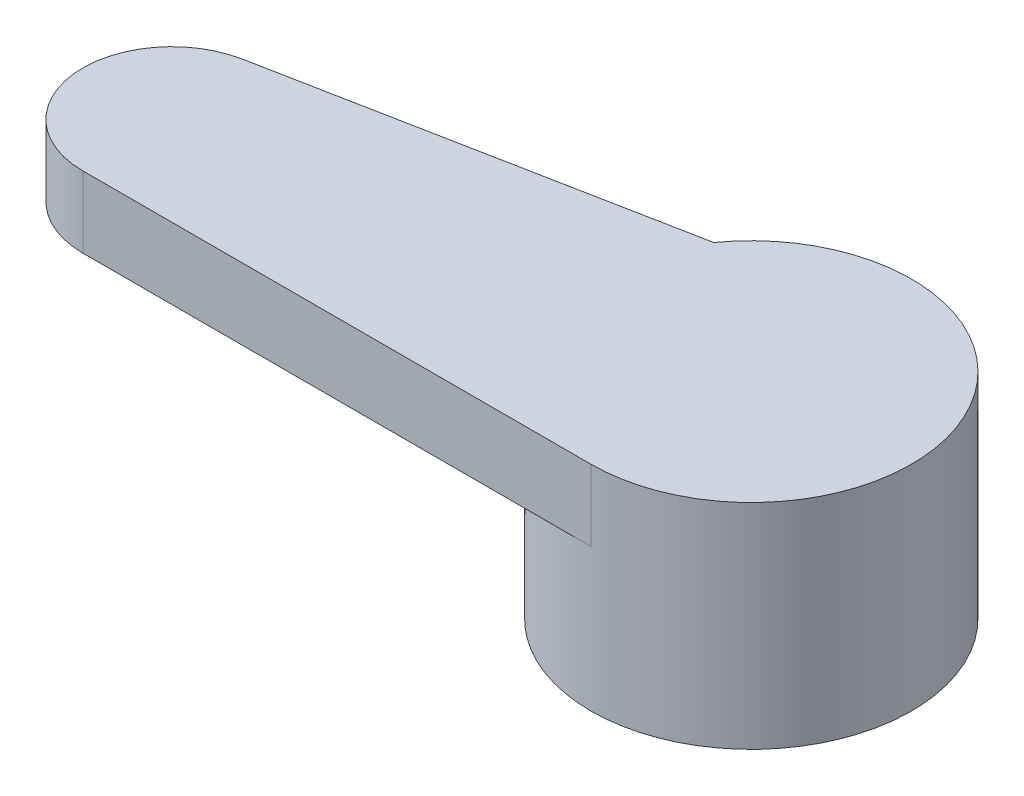
ISO-10303-21;
HEADER;
FILE_DESCRIPTION(('STEP AP214'),'2;1');
FILE_NAME('part.step','',(''),(''),'','','');
FILE_SCHEMA(('AUTOMOTIVE_DESIGN { 1 0 10303 214 1 1 1 1 }'));
ENDSEC;
DATA;
#1=APPLICATION_CONTEXT('core data for automotive mechanical design processes');
#2=APPLICATION_PROTOCOL_DEFINITION('international standard','automotive_design',2000,#1);
#3=PRODUCT_CONTEXT('',#1,'mechanical');
#4=PRODUCT('Part','Part','',(#3));
#5=PRODUCT_RELATED_PRODUCT_CATEGORY('part','',(#4));
#6=PRODUCT_DEFINITION_FORMATION('','',#4);
#7=PRODUCT_DEFINITION_CONTEXT('part definition',#1,'design');
#8=PRODUCT_DEFINITION('design','',#6,#7);
#9=PRODUCT_DEFINITION_SHAPE('','',#8);
#10=(LENGTH_UNIT() NAMED_UNIT(*) SI_UNIT(.MILLI.,.METRE.));
#11=(NAMED_UNIT(*) PLANE_ANGLE_UNIT() SI_UNIT($,.RADIAN.));
#12=(NAMED_UNIT(*) SI_UNIT($,.STERADIAN.) SOLID_ANGLE_UNIT());
#13=UNCERTAINTY_MEASURE_WITH_UNIT(LENGTH_MEASURE(1.E-05),#10,'distance_accuracy_value','');
#14=(GEOMETRIC_REPRESENTATION_CONTEXT(3) GLOBAL_UNCERTAINTY_ASSIGNED_CONTEXT((#13)) GLOBAL_UNIT_ASSIGNED_CONTEXT((#10,
#11,#12)) REPRESENTATION_CONTEXT('',''));
#15=CARTESIAN_POINT('',(0.,0.,0.));
#16=DIRECTION('',(0.,0.,1.));
#17=DIRECTION('',(1.,0.,0.));
#18=AXIS2_PLACEMENT_3D('',#15,#16,#17);
#19=CARTESIAN_POINT('',(0.,6.,0.));
#20=DIRECTION('',(0.,-1.,0.));
#21=DIRECTION('',(0.,0.,-1.));
#22=AXIS2_PLACEMENT_3D('',#19,#20,#21);
#23=CYLINDRICAL_SURFACE('',#22,4.5);
#24=CARTESIAN_POINT('',(0.,6.,0.));
#25=DIRECTION('',(0.,1.,0.));
#26=DIRECTION('',(0.,0.,1.));
#27=AXIS2_PLACEMENT_3D('',#24,#25,#26);
#28=CIRCLE('',#27,4.5);
#29=CARTESIAN_POINT('',(0.,6.,4.5));
#30=VERTEX_POINT('',#29);
#31=CARTESIAN_POINT('',(-3.66498277832681,6.,-2.61111111111111));
#32=VERTEX_POINT('',#31);
#33=EDGE_CURVE('E11',#30,#32,#28,.T.);
#34=ORIENTED_EDGE('',*,*,#33,.F.);
#35=DIRECTION('',(0.,1.,0.));
#36=VECTOR('',#35,1.);
#37=CARTESIAN_POINT('',(0.,4.,4.5));
#38=LINE('',#37,#36);
#39=CARTESIAN_POINT('',(0.,4.,4.5));
#40=VERTEX_POINT('',#39);
#41=EDGE_CURVE('E101',#40,#30,#38,.T.);
#42=ORIENTED_EDGE('',*,*,#41,.F.);
#43=CARTESIAN_POINT('',(0.,4.,0.));
#44=DIRECTION('',(0.,-1.,0.));
#45=DIRECTION('',(0.,0.,1.));
#46=AXIS2_PLACEMENT_3D('',#43,#44,#45);
#47=CIRCLE('',#46,4.5);
#48=CARTESIAN_POINT('',(-3.66498277832681,4.,-2.61111111111111));
#49=VERTEX_POINT('',#48);
#50=EDGE_CURVE('E55',#40,#49,#47,.T.);
#51=ORIENTED_EDGE('',*,*,#50,.T.);
#52=DIRECTION('',(0.,1.,0.));
#53=VECTOR('',#52,1.);
#54=CARTESIAN_POINT('',(-3.66498277832681,4.,-2.61111111111111));
#55=LINE('',#54,#53);
#56=EDGE_CURVE('E79',#49,#32,#55,.T.);
#57=ORIENTED_EDGE('',*,*,#56,.T.);
#58=EDGE_LOOP('',(#34,#42,#51,#57));
#59=FACE_BOUND('',#58,.T.);
#60=CARTESIAN_POINT('',(0.,0.,0.));
#61=DIRECTION('',(0.,1.,0.));
#62=DIRECTION('',(0.,0.,1.));
#63=AXIS2_PLACEMENT_3D('',#60,#61,#62);
#64=CIRCLE('',#63,4.5);
#65=CARTESIAN_POINT('',(0.,0.,4.5));
#66=VERTEX_POINT('',#65);
#67=EDGE_CURVE('E36',#66,#66,#64,.T.);
#68=ORIENTED_EDGE('',*,*,#67,.T.);
#69=EDGE_LOOP('',(#68));
#70=FACE_BOUND('',#69,.T.);
#71=ADVANCED_FACE('F33',(#59,#70),#23,.T.);
#72=CARTESIAN_POINT('',(0.,6.,0.));
#73=DIRECTION('',(0.,1.,0.));
#74=DIRECTION('',(0.,0.,1.));
#75=AXIS2_PLACEMENT_3D('',#72,#73,#74);
#76=PLANE('',#75);
#77=ORIENTED_EDGE('',*,*,#33,.T.);
#78=DIRECTION('',(-0.981547865960079,0.,0.191216596636419));
#79=VECTOR('',#78,1.);
#80=CARTESIAN_POINT('',(-14.7384762675718,6.,-0.453869664900196));
#81=LINE('',#80,#79);
#82=CARTESIAN_POINT('',(-14.7384762675718,6.,-0.453869664900197));
#83=VERTEX_POINT('',#82);
#84=EDGE_CURVE('E97',#32,#83,#81,.T.);
#85=ORIENTED_EDGE('',*,*,#84,.T.);
#86=CARTESIAN_POINT('',(-14.2604347759807,6.,2.));
#87=DIRECTION('',(0.,1.,0.));
#88=DIRECTION('',(0.,0.,-1.));
#89=AXIS2_PLACEMENT_3D('',#86,#87,#88);
#90=CIRCLE('',#89,2.5);
#91=CARTESIAN_POINT('',(-14.2604347759807,6.,4.5));
#92=VERTEX_POINT('',#91);
#93=EDGE_CURVE('E85',#83,#92,#90,.T.);
#94=ORIENTED_EDGE('',*,*,#93,.T.);
#95=DIRECTION('',(1.,0.,0.));
#96=VECTOR('',#95,1.);
#97=CARTESIAN_POINT('',(0.,6.,4.5));
#98=LINE('',#97,#96);
#99=EDGE_CURVE('E46',#92,#30,#98,.T.);
#100=ORIENTED_EDGE('',*,*,#99,.T.);
#101=EDGE_LOOP('',(#77,#85,#94,#100));
#102=FACE_BOUND('',#101,.T.);
#103=ADVANCED_FACE('F108',(#102),#76,.T.);
#104=CARTESIAN_POINT('',(0.,0.,0.));
#105=DIRECTION('',(0.,1.,0.));
#106=DIRECTION('',(0.,0.,1.));
#107=AXIS2_PLACEMENT_3D('',#104,#105,#106);
#108=PLANE('',#107);
#109=ORIENTED_EDGE('',*,*,#67,.F.);
#110=EDGE_LOOP('',(#109));
#111=FACE_BOUND('',#110,.T.);
#112=ADVANCED_FACE('F112',(#111),#108,.F.);
#113=CARTESIAN_POINT('',(0.,4.,4.5));
#114=DIRECTION('',(0.,0.,1.));
#115=DIRECTION('',(1.,0.,0.));
#116=AXIS2_PLACEMENT_3D('',#113,#114,#115);
#117=PLANE('',#116);
#118=ORIENTED_EDGE('',*,*,#99,.F.);
#119=DIRECTION('',(0.,1.,0.));
#120=VECTOR('',#119,1.);
#121=CARTESIAN_POINT('',(-14.2604347759807,4.,4.5));
#122=LINE('',#121,#120);
#123=CARTESIAN_POINT('',(-14.2604347759807,4.,4.5));
#124=VERTEX_POINT('',#123);
#125=EDGE_CURVE('E73',#124,#92,#122,.T.);
#126=ORIENTED_EDGE('',*,*,#125,.F.);
#127=DIRECTION('',(1.,0.,0.));
#128=VECTOR('',#127,1.);
#129=CARTESIAN_POINT('',(0.,4.,4.5));
#130=LINE('',#129,#128);
#131=EDGE_CURVE('E90',#124,#40,#130,.T.);
#132=ORIENTED_EDGE('',*,*,#131,.T.);
#133=ORIENTED_EDGE('',*,*,#41,.T.);
#134=EDGE_LOOP('',(#118,#126,#132,#133));
#135=FACE_BOUND('',#134,.T.);
#136=ADVANCED_FACE('F110',(#135),#117,.T.);
#137=CARTESIAN_POINT('',(-14.2604347759807,4.,2.));
#138=DIRECTION('',(0.,1.,0.));
#139=DIRECTION('',(0.,0.,1.));
#140=AXIS2_PLACEMENT_3D('',#137,#138,#139);
#141=CYLINDRICAL_SURFACE('',#140,2.5);
#142=ORIENTED_EDGE('',*,*,#93,.F.);
#143=DIRECTION('',(0.,1.,0.));
#144=VECTOR('',#143,1.);
#145=CARTESIAN_POINT('',(-14.7384762675718,4.,-0.453869664900197));
#146=LINE('',#145,#144);
#147=CARTESIAN_POINT('',(-14.7384762675718,4.,-0.453869664900197));
#148=VERTEX_POINT('',#147);
#149=EDGE_CURVE('E81',#148,#83,#146,.T.);
#150=ORIENTED_EDGE('',*,*,#149,.F.);
#151=CARTESIAN_POINT('',(-14.2604347759807,4.,2.));
#152=DIRECTION('',(0.,1.,0.));
#153=DIRECTION('',(0.,0.,-1.));
#154=AXIS2_PLACEMENT_3D('',#151,#152,#153);
#155=CIRCLE('',#154,2.5);
#156=EDGE_CURVE('E84',#148,#124,#155,.T.);
#157=ORIENTED_EDGE('',*,*,#156,.T.);
#158=ORIENTED_EDGE('',*,*,#125,.T.);
#159=EDGE_LOOP('',(#142,#150,#157,#158));
#160=FACE_BOUND('',#159,.T.);
#161=ADVANCED_FACE('F83',(#160),#141,.T.);
#162=CARTESIAN_POINT('',(-14.7384762675718,4.,-0.453869664900196));
#163=DIRECTION('',(-0.191216596636419,0.,-0.981547865960079));
#164=DIRECTION('',(-0.981547865960079,0.,0.191216596636418));
#165=AXIS2_PLACEMENT_3D('',#162,#163,#164);
#166=PLANE('',#165);
#167=ORIENTED_EDGE('',*,*,#84,.F.);
#168=ORIENTED_EDGE('',*,*,#56,.F.);
#169=DIRECTION('',(-0.981547865960079,0.,0.191216596636419));
#170=VECTOR('',#169,1.);
#171=CARTESIAN_POINT('',(-14.7384762675718,4.,-0.453869664900196));
#172=LINE('',#171,#170);
#173=EDGE_CURVE('E89',#49,#148,#172,.T.);
#174=ORIENTED_EDGE('',*,*,#173,.T.);
#175=ORIENTED_EDGE('',*,*,#149,.T.);
#176=EDGE_LOOP('',(#167,#168,#174,#175));
#177=FACE_BOUND('',#176,.T.);
#178=ADVANCED_FACE('F92',(#177),#166,.T.);
#179=CARTESIAN_POINT('',(0.,4.,0.));
#180=DIRECTION('',(0.,1.,0.));
#181=DIRECTION('',(0.,0.,1.));
#182=AXIS2_PLACEMENT_3D('',#179,#180,#181);
#183=PLANE('',#182);
#184=ORIENTED_EDGE('',*,*,#50,.F.);
#185=ORIENTED_EDGE('',*,*,#131,.F.);
#186=ORIENTED_EDGE('',*,*,#156,.F.);
#187=ORIENTED_EDGE('',*,*,#173,.F.);
#188=EDGE_LOOP('',(#184,#185,#186,#187));
#189=FACE_BOUND('',#188,.T.);
#190=ADVANCED_FACE('F88',(#189),#183,.F.);
#191=CLOSED_SHELL('',(#71,#103,#112,#136,#161,#178,#190));
#192=MANIFOLD_SOLID_BREP('B2',#191);
#193=ADVANCED_BREP_SHAPE_REPRESENTATION('',(#18,#192),#14);
#194=SHAPE_DEFINITION_REPRESENTATION(#9,#193);
ENDSEC;
END-ISO-10303-21;
